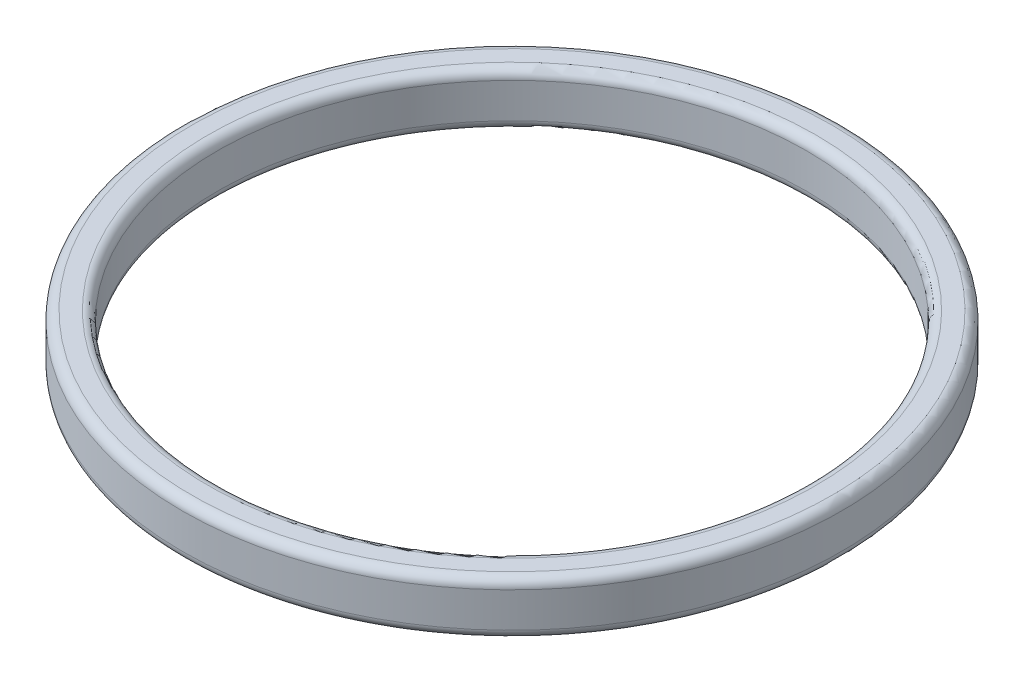
ISO-10303-21;
HEADER;
FILE_DESCRIPTION(('STEP AP214'),'2;1');
FILE_NAME('part.step','',(''),(''),'','','');
FILE_SCHEMA(('AUTOMOTIVE_DESIGN { 1 0 10303 214 1 1 1 1 }'));
ENDSEC;
DATA;
#1=APPLICATION_CONTEXT('core data for automotive mechanical design processes');
#2=APPLICATION_PROTOCOL_DEFINITION('international standard','automotive_design',2000,#1);
#3=PRODUCT_CONTEXT('',#1,'mechanical');
#4=PRODUCT('Part','Part','',(#3));
#5=PRODUCT_RELATED_PRODUCT_CATEGORY('part','',(#4));
#6=PRODUCT_DEFINITION_FORMATION('','',#4);
#7=PRODUCT_DEFINITION_CONTEXT('part definition',#1,'design');
#8=PRODUCT_DEFINITION('design','',#6,#7);
#9=PRODUCT_DEFINITION_SHAPE('','',#8);
#10=(LENGTH_UNIT() NAMED_UNIT(*) SI_UNIT(.MILLI.,.METRE.));
#11=(NAMED_UNIT(*) PLANE_ANGLE_UNIT() SI_UNIT($,.RADIAN.));
#12=(NAMED_UNIT(*) SI_UNIT($,.STERADIAN.) SOLID_ANGLE_UNIT());
#13=UNCERTAINTY_MEASURE_WITH_UNIT(LENGTH_MEASURE(1.E-05),#10,'distance_accuracy_value','');
#14=(GEOMETRIC_REPRESENTATION_CONTEXT(3) GLOBAL_UNCERTAINTY_ASSIGNED_CONTEXT((#13)) GLOBAL_UNIT_ASSIGNED_CONTEXT((#10,
#11,#12)) REPRESENTATION_CONTEXT('',''));
#15=CARTESIAN_POINT('',(0.,0.,0.));
#16=DIRECTION('',(0.,0.,1.));
#17=DIRECTION('',(1.,0.,0.));
#18=AXIS2_PLACEMENT_3D('',#15,#16,#17);
#19=CARTESIAN_POINT('',(0.,0.5,0.));
#20=DIRECTION('',(0.,-1.,0.));
#21=DIRECTION('',(0.,0.,-1.));
#22=AXIS2_PLACEMENT_3D('',#19,#20,#21);
#23=TOROIDAL_SURFACE('',#22,17.4,0.5);
#24=CARTESIAN_POINT('',(0.,0.,0.));
#25=DIRECTION('',(0.,-1.,0.));
#26=DIRECTION('',(0.,0.,-1.));
#27=AXIS2_PLACEMENT_3D('',#24,#25,#26);
#28=CIRCLE('',#27,17.4);
#29=CARTESIAN_POINT('',(0.,0.,-17.4));
#30=VERTEX_POINT('',#29);
#31=EDGE_CURVE('E64',#30,#30,#28,.T.);
#32=ORIENTED_EDGE('',*,*,#31,.F.);
#33=EDGE_LOOP('',(#32));
#34=FACE_BOUND('',#33,.T.);
#35=CARTESIAN_POINT('',(0.,0.500000000000004,0.));
#36=DIRECTION('',(0.,-1.,0.));
#37=DIRECTION('',(0.,0.,-1.));
#38=AXIS2_PLACEMENT_3D('',#35,#36,#37);
#39=CIRCLE('',#38,17.9);
#40=CARTESIAN_POINT('',(0.,0.500000000000004,-17.9));
#41=VERTEX_POINT('',#40);
#42=EDGE_CURVE('E10',#41,#41,#39,.T.);
#43=ORIENTED_EDGE('',*,*,#42,.T.);
#44=EDGE_LOOP('',(#43));
#45=FACE_BOUND('',#44,.T.);
#46=ADVANCED_FACE('F36',(#34,#45),#23,.T.);
#47=CARTESIAN_POINT('',(0.,0.,0.));
#48=DIRECTION('',(0.,-1.,0.));
#49=DIRECTION('',(0.,0.,-1.));
#50=AXIS2_PLACEMENT_3D('',#47,#48,#49);
#51=CYLINDRICAL_SURFACE('',#50,17.9);
#52=ORIENTED_EDGE('',*,*,#42,.F.);
#53=EDGE_LOOP('',(#52));
#54=FACE_BOUND('',#53,.T.);
#55=CARTESIAN_POINT('',(0.,2.4,0.));
#56=DIRECTION('',(0.,-1.,0.));
#57=DIRECTION('',(0.,0.,-1.));
#58=AXIS2_PLACEMENT_3D('',#55,#56,#57);
#59=CIRCLE('',#58,17.9);
#60=CARTESIAN_POINT('',(0.,2.4,-17.9));
#61=VERTEX_POINT('',#60);
#62=EDGE_CURVE('E42',#61,#61,#59,.T.);
#63=ORIENTED_EDGE('',*,*,#62,.T.);
#64=EDGE_LOOP('',(#63));
#65=FACE_BOUND('',#64,.T.);
#66=ADVANCED_FACE('F71',(#54,#65),#51,.T.);
#67=CARTESIAN_POINT('',(0.,2.4,0.));
#68=DIRECTION('',(0.,-1.,0.));
#69=DIRECTION('',(0.,0.,-1.));
#70=AXIS2_PLACEMENT_3D('',#67,#68,#69);
#71=TOROIDAL_SURFACE('',#70,17.4,0.5);
#72=ORIENTED_EDGE('',*,*,#62,.F.);
#73=EDGE_LOOP('',(#72));
#74=FACE_BOUND('',#73,.T.);
#75=CARTESIAN_POINT('',(0.,2.9,0.));
#76=DIRECTION('',(0.,-1.,0.));
#77=DIRECTION('',(0.,0.,-1.));
#78=AXIS2_PLACEMENT_3D('',#75,#76,#77);
#79=CIRCLE('',#78,17.4);
#80=CARTESIAN_POINT('',(0.,2.9,-17.4));
#81=VERTEX_POINT('',#80);
#82=EDGE_CURVE('E46',#81,#81,#79,.T.);
#83=ORIENTED_EDGE('',*,*,#82,.T.);
#84=EDGE_LOOP('',(#83));
#85=FACE_BOUND('',#84,.T.);
#86=ADVANCED_FACE('F75',(#74,#85),#71,.T.);
#87=CARTESIAN_POINT('',(-16.5,2.9,0.));
#88=DIRECTION('',(0.,-1.,0.));
#89=DIRECTION('',(0.,0.,-1.));
#90=AXIS2_PLACEMENT_3D('',#87,#88,#89);
#91=PLANE('',#90);
#92=ORIENTED_EDGE('',*,*,#82,.F.);
#93=EDGE_LOOP('',(#92));
#94=FACE_BOUND('',#93,.T.);
#95=CARTESIAN_POINT('',(0.,2.9,0.));
#96=DIRECTION('',(0.,-1.,0.));
#97=DIRECTION('',(0.,0.,-1.));
#98=AXIS2_PLACEMENT_3D('',#95,#96,#97);
#99=CIRCLE('',#98,16.5);
#100=CARTESIAN_POINT('',(0.,2.9,-16.5));
#101=VERTEX_POINT('',#100);
#102=EDGE_CURVE('E50',#101,#101,#99,.T.);
#103=ORIENTED_EDGE('',*,*,#102,.T.);
#104=EDGE_LOOP('',(#103));
#105=FACE_BOUND('',#104,.T.);
#106=ADVANCED_FACE('F80',(#94,#105),#91,.F.);
#107=CARTESIAN_POINT('',(0.,2.4,0.));
#108=DIRECTION('',(0.,-1.,0.));
#109=DIRECTION('',(0.,0.,-1.));
#110=AXIS2_PLACEMENT_3D('',#107,#108,#109);
#111=TOROIDAL_SURFACE('',#110,16.5,0.5);
#112=ORIENTED_EDGE('',*,*,#102,.F.);
#113=EDGE_LOOP('',(#112));
#114=FACE_BOUND('',#113,.T.);
#115=CARTESIAN_POINT('',(0.,2.4,0.));
#116=DIRECTION('',(0.,-1.,0.));
#117=DIRECTION('',(0.,0.,-1.));
#118=AXIS2_PLACEMENT_3D('',#115,#116,#117);
#119=CIRCLE('',#118,16.);
#120=CARTESIAN_POINT('',(0.,2.4,-16.));
#121=VERTEX_POINT('',#120);
#122=EDGE_CURVE('E55',#121,#121,#119,.T.);
#123=ORIENTED_EDGE('',*,*,#122,.T.);
#124=EDGE_LOOP('',(#123));
#125=FACE_BOUND('',#124,.T.);
#126=ADVANCED_FACE('F86',(#114,#125),#111,.T.);
#127=CARTESIAN_POINT('',(0.,0.,0.));
#128=DIRECTION('',(0.,-1.,0.));
#129=DIRECTION('',(0.,0.,-1.));
#130=AXIS2_PLACEMENT_3D('',#127,#128,#129);
#131=CYLINDRICAL_SURFACE('',#130,16.);
#132=ORIENTED_EDGE('',*,*,#122,.F.);
#133=EDGE_LOOP('',(#132));
#134=FACE_BOUND('',#133,.T.);
#135=CARTESIAN_POINT('',(0.,0.5,0.));
#136=DIRECTION('',(0.,-1.,0.));
#137=DIRECTION('',(0.,0.,-1.));
#138=AXIS2_PLACEMENT_3D('',#135,#136,#137);
#139=CIRCLE('',#138,16.);
#140=CARTESIAN_POINT('',(0.,0.5,-16.));
#141=VERTEX_POINT('',#140);
#142=EDGE_CURVE('E58',#141,#141,#139,.T.);
#143=ORIENTED_EDGE('',*,*,#142,.T.);
#144=EDGE_LOOP('',(#143));
#145=FACE_BOUND('',#144,.T.);
#146=ADVANCED_FACE('F90',(#134,#145),#131,.F.);
#147=CARTESIAN_POINT('',(0.,0.5,0.));
#148=DIRECTION('',(0.,-1.,0.));
#149=DIRECTION('',(0.,0.,-1.));
#150=AXIS2_PLACEMENT_3D('',#147,#148,#149);
#151=TOROIDAL_SURFACE('',#150,16.5,0.5);
#152=ORIENTED_EDGE('',*,*,#142,.F.);
#153=EDGE_LOOP('',(#152));
#154=FACE_BOUND('',#153,.T.);
#155=CARTESIAN_POINT('',(0.,0.,0.));
#156=DIRECTION('',(0.,-1.,0.));
#157=DIRECTION('',(0.,0.,-1.));
#158=AXIS2_PLACEMENT_3D('',#155,#156,#157);
#159=CIRCLE('',#158,16.5);
#160=CARTESIAN_POINT('',(0.,0.,-16.5));
#161=VERTEX_POINT('',#160);
#162=EDGE_CURVE('E61',#161,#161,#159,.T.);
#163=ORIENTED_EDGE('',*,*,#162,.T.);
#164=EDGE_LOOP('',(#163));
#165=FACE_BOUND('',#164,.T.);
#166=ADVANCED_FACE('F94',(#154,#165),#151,.T.);
#167=CARTESIAN_POINT('',(-16.5,0.,0.));
#168=DIRECTION('',(0.,1.,0.));
#169=DIRECTION('',(0.,0.,1.));
#170=AXIS2_PLACEMENT_3D('',#167,#168,#169);
#171=PLANE('',#170);
#172=ORIENTED_EDGE('',*,*,#162,.F.);
#173=EDGE_LOOP('',(#172));
#174=FACE_BOUND('',#173,.T.);
#175=ORIENTED_EDGE('',*,*,#31,.T.);
#176=EDGE_LOOP('',(#175));
#177=FACE_BOUND('',#176,.T.);
#178=ADVANCED_FACE('F68',(#174,#177),#171,.F.);
#179=CLOSED_SHELL('',(#46,#66,#86,#106,#126,#146,#166,#178));
#180=MANIFOLD_SOLID_BREP('B2',#179);
#181=ADVANCED_BREP_SHAPE_REPRESENTATION('',(#18,#180),#14);
#182=SHAPE_DEFINITION_REPRESENTATION(#9,#181);
ENDSEC;
END-ISO-10303-21;
